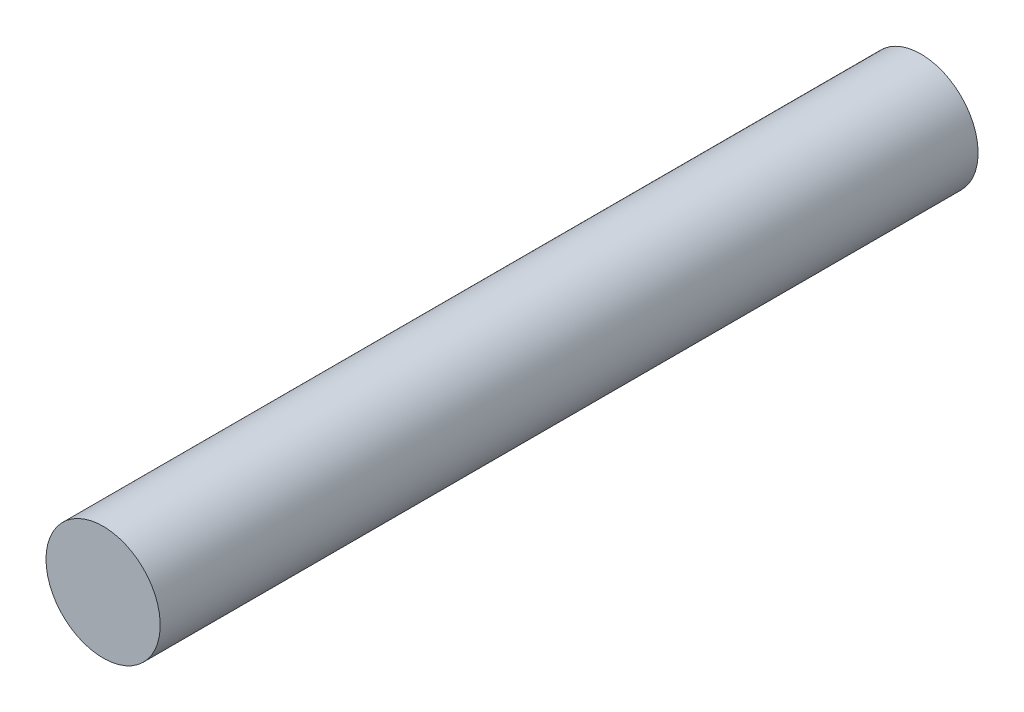
ISO-10303-21;
HEADER;
FILE_DESCRIPTION(('STEP AP214'),'2;1');
FILE_NAME('part.step','',(''),(''),'','','');
FILE_SCHEMA(('AUTOMOTIVE_DESIGN { 1 0 10303 214 1 1 1 1 }'));
ENDSEC;
DATA;
#1=APPLICATION_CONTEXT('core data for automotive mechanical design processes');
#2=APPLICATION_PROTOCOL_DEFINITION('international standard','automotive_design',2000,#1);
#3=PRODUCT_CONTEXT('',#1,'mechanical');
#4=PRODUCT('Part','Part','',(#3));
#5=PRODUCT_RELATED_PRODUCT_CATEGORY('part','',(#4));
#6=PRODUCT_DEFINITION_FORMATION('','',#4);
#7=PRODUCT_DEFINITION_CONTEXT('part definition',#1,'design');
#8=PRODUCT_DEFINITION('design','',#6,#7);
#9=PRODUCT_DEFINITION_SHAPE('','',#8);
#10=(LENGTH_UNIT() NAMED_UNIT(*) SI_UNIT(.MILLI.,.METRE.));
#11=(NAMED_UNIT(*) PLANE_ANGLE_UNIT() SI_UNIT($,.RADIAN.));
#12=(NAMED_UNIT(*) SI_UNIT($,.STERADIAN.) SOLID_ANGLE_UNIT());
#13=UNCERTAINTY_MEASURE_WITH_UNIT(LENGTH_MEASURE(1.E-05),#10,'distance_accuracy_value','');
#14=(GEOMETRIC_REPRESENTATION_CONTEXT(3) GLOBAL_UNCERTAINTY_ASSIGNED_CONTEXT((#13)) GLOBAL_UNIT_ASSIGNED_CONTEXT((#10,
#11,#12)) REPRESENTATION_CONTEXT('',''));
#15=CARTESIAN_POINT('',(0.,0.,0.));
#16=DIRECTION('',(0.,0.,1.));
#17=DIRECTION('',(1.,0.,0.));
#18=AXIS2_PLACEMENT_3D('',#15,#16,#17);
#19=CARTESIAN_POINT('',(0.,0.,35.8));
#20=DIRECTION('',(0.,0.,-1.));
#21=DIRECTION('',(-1.,0.,0.));
#22=AXIS2_PLACEMENT_3D('',#19,#20,#21);
#23=CYLINDRICAL_SURFACE('',#22,2.5);
#24=CARTESIAN_POINT('',(0.,0.,35.8));
#25=DIRECTION('',(0.,0.,1.));
#26=DIRECTION('',(1.,0.,0.));
#27=AXIS2_PLACEMENT_3D('',#24,#25,#26);
#28=CIRCLE('',#27,2.5);
#29=CARTESIAN_POINT('',(-2.5,0.,35.8));
#30=VERTEX_POINT('',#29);
#31=EDGE_CURVE('E10',#30,#30,#28,.T.);
#32=CARTESIAN_POINT('',(0.,0.,0.));
#33=DIRECTION('',(0.,0.,1.));
#34=DIRECTION('',(1.,0.,0.));
#35=AXIS2_PLACEMENT_3D('',#32,#33,#34);
#36=CIRCLE('',#35,2.5);
#37=CARTESIAN_POINT('',(-2.5,0.,0.));
#38=VERTEX_POINT('',#37);
#39=EDGE_CURVE('E38',#38,#38,#36,.T.);
#40=CARTESIAN_POINT('',(-2.5,0.,35.8));
#41=CARTESIAN_POINT('',(-2.5,0.,35.4270833333333));
#42=CARTESIAN_POINT('',(-2.5,0.,35.0541666666667));
#43=CARTESIAN_POINT('',(-2.5,0.,34.3083333333333));
#44=CARTESIAN_POINT('',(-2.5,0.,33.9354166666667));
#45=CARTESIAN_POINT('',(-2.5,0.,33.1895833333333));
#46=CARTESIAN_POINT('',(-2.5,0.,32.8166666666667));
#47=CARTESIAN_POINT('',(-2.5,0.,32.0708333333333));
#48=CARTESIAN_POINT('',(-2.5,0.,31.6979166666667));
#49=CARTESIAN_POINT('',(-2.5,0.,30.9520833333333));
#50=CARTESIAN_POINT('',(-2.5,0.,30.5791666666667));
#51=CARTESIAN_POINT('',(-2.5,0.,29.8333333333333));
#52=CARTESIAN_POINT('',(-2.5,0.,29.4604166666667));
#53=CARTESIAN_POINT('',(-2.5,0.,28.7145833333333));
#54=CARTESIAN_POINT('',(-2.5,0.,28.3416666666667));
#55=CARTESIAN_POINT('',(-2.5,0.,27.5958333333333));
#56=CARTESIAN_POINT('',(-2.5,0.,27.2229166666667));
#57=CARTESIAN_POINT('',(-2.5,0.,26.4770833333333));
#58=CARTESIAN_POINT('',(-2.5,0.,26.1041666666667));
#59=CARTESIAN_POINT('',(-2.5,0.,25.3583333333333));
#60=CARTESIAN_POINT('',(-2.5,0.,24.9854166666667));
#61=CARTESIAN_POINT('',(-2.5,0.,24.2395833333333));
#62=CARTESIAN_POINT('',(-2.5,0.,23.8666666666667));
#63=CARTESIAN_POINT('',(-2.5,0.,23.1208333333333));
#64=CARTESIAN_POINT('',(-2.5,0.,22.7479166666667));
#65=CARTESIAN_POINT('',(-2.5,0.,22.0020833333333));
#66=CARTESIAN_POINT('',(-2.5,0.,21.6291666666667));
#67=CARTESIAN_POINT('',(-2.5,0.,20.8833333333333));
#68=CARTESIAN_POINT('',(-2.5,0.,20.5104166666667));
#69=CARTESIAN_POINT('',(-2.5,0.,19.7645833333333));
#70=CARTESIAN_POINT('',(-2.5,0.,19.3916666666667));
#71=CARTESIAN_POINT('',(-2.5,0.,18.6458333333333));
#72=CARTESIAN_POINT('',(-2.5,0.,18.2729166666667));
#73=CARTESIAN_POINT('',(-2.5,0.,17.5270833333333));
#74=CARTESIAN_POINT('',(-2.5,0.,17.1541666666667));
#75=CARTESIAN_POINT('',(-2.5,0.,16.4083333333333));
#76=CARTESIAN_POINT('',(-2.5,0.,16.0354166666667));
#77=CARTESIAN_POINT('',(-2.5,0.,15.2895833333333));
#78=CARTESIAN_POINT('',(-2.5,0.,14.9166666666667));
#79=CARTESIAN_POINT('',(-2.5,0.,14.1708333333333));
#80=CARTESIAN_POINT('',(-2.5,0.,13.7979166666667));
#81=CARTESIAN_POINT('',(-2.5,0.,13.0520833333333));
#82=CARTESIAN_POINT('',(-2.5,0.,12.6791666666667));
#83=CARTESIAN_POINT('',(-2.5,0.,11.9333333333333));
#84=CARTESIAN_POINT('',(-2.5,0.,11.5604166666667));
#85=CARTESIAN_POINT('',(-2.5,0.,10.8145833333333));
#86=CARTESIAN_POINT('',(-2.5,0.,10.4416666666667));
#87=CARTESIAN_POINT('',(-2.5,0.,9.69583333333333));
#88=CARTESIAN_POINT('',(-2.5,0.,9.32291666666666));
#89=CARTESIAN_POINT('',(-2.5,0.,8.57708333333333));
#90=CARTESIAN_POINT('',(-2.5,0.,8.20416666666666));
#91=CARTESIAN_POINT('',(-2.5,0.,7.45833333333333));
#92=CARTESIAN_POINT('',(-2.5,0.,7.08541666666666));
#93=CARTESIAN_POINT('',(-2.5,0.,6.33958333333333));
#94=CARTESIAN_POINT('',(-2.5,0.,5.96666666666666));
#95=CARTESIAN_POINT('',(-2.5,0.,5.22083333333333));
#96=CARTESIAN_POINT('',(-2.5,0.,4.84791666666666));
#97=CARTESIAN_POINT('',(-2.5,0.,4.10208333333333));
#98=CARTESIAN_POINT('',(-2.5,0.,3.72916666666666));
#99=CARTESIAN_POINT('',(-2.5,0.,2.98333333333333));
#100=CARTESIAN_POINT('',(-2.5,0.,2.61041666666666));
#101=CARTESIAN_POINT('',(-2.5,0.,1.86458333333333));
#102=CARTESIAN_POINT('',(-2.5,0.,1.49166666666666));
#103=CARTESIAN_POINT('',(-2.5,0.,0.745833333333328));
#104=CARTESIAN_POINT('',(-2.5,0.,0.37291666666666));
#105=CARTESIAN_POINT('',(-2.5,0.,0.));
#106=B_SPLINE_CURVE_WITH_KNOTS('',3,(#40,#41,#42,#43,#44,#45,#46,#47,#48,#49,#50,#51,#52,#53,
#54,#55,#56,#57,#58,#59,#60,#61,#62,#63,#64,#65,#66,#67,#68,#69,#70,#71,#72,#73,#74,#75,#76,#77,
#78,#79,#80,#81,#82,#83,#84,#85,#86,#87,#88,#89,#90,#91,#92,#93,#94,#95,#96,#97,#98,#99,#100,
#101,#102,#103,#104,#105),.UNSPECIFIED.,.F.,.F.,(4,2,2,2,2,2,2,2,2,2,2,2,2,2,2,2,2,2,2,2,2,2,2,
2,2,2,2,2,2,2,2,2,4),(0.,1.11874999999999,2.2375,3.35625,4.475,5.59374999999999,6.7125,7.83125,
8.95,10.06875,11.1875,12.30625,13.425,14.54375,15.6625,16.78125,17.9,19.01875,20.1375,21.25625,
22.375,23.49375,24.6125,25.73125,26.85,27.96875,29.0875,30.20625,31.325,32.44375,33.5625,
34.68125,35.8),.UNSPECIFIED.);
#107=EDGE_CURVE('BSEAM35',#30,#38,#106,.T.);
#108=ORIENTED_EDGE('',*,*,#31,.F.);
#109=ORIENTED_EDGE('',*,*,#39,.T.);
#110=ORIENTED_EDGE('',*,*,#107,.T.);
#111=ORIENTED_EDGE('',*,*,#107,.F.);
#112=EDGE_LOOP('',(#108,#110,#109,#111));
#113=FACE_BOUND('',#112,.T.);
#114=ADVANCED_FACE('F35',(#113),#23,.T.);
#115=CARTESIAN_POINT('',(0.,0.,35.8));
#116=DIRECTION('',(0.,0.,1.));
#117=DIRECTION('',(1.,0.,0.));
#118=AXIS2_PLACEMENT_3D('',#115,#116,#117);
#119=PLANE('',#118);
#120=ORIENTED_EDGE('',*,*,#31,.T.);
#121=EDGE_LOOP('',(#120));
#122=FACE_BOUND('',#121,.T.);
#123=ADVANCED_FACE('F50',(#122),#119,.T.);
#124=CARTESIAN_POINT('',(0.,0.,0.));
#125=DIRECTION('',(0.,0.,1.));
#126=DIRECTION('',(1.,0.,0.));
#127=AXIS2_PLACEMENT_3D('',#124,#125,#126);
#128=PLANE('',#127);
#129=ORIENTED_EDGE('',*,*,#39,.F.);
#130=EDGE_LOOP('',(#129));
#131=FACE_BOUND('',#130,.T.);
#132=ADVANCED_FACE('F48',(#131),#128,.F.);
#133=CLOSED_SHELL('',(#114,#123,#132));
#134=MANIFOLD_SOLID_BREP('B2',#133);
#135=ADVANCED_BREP_SHAPE_REPRESENTATION('',(#18,#134),#14);
#136=SHAPE_DEFINITION_REPRESENTATION(#9,#135);
ENDSEC;
END-ISO-10303-21;
